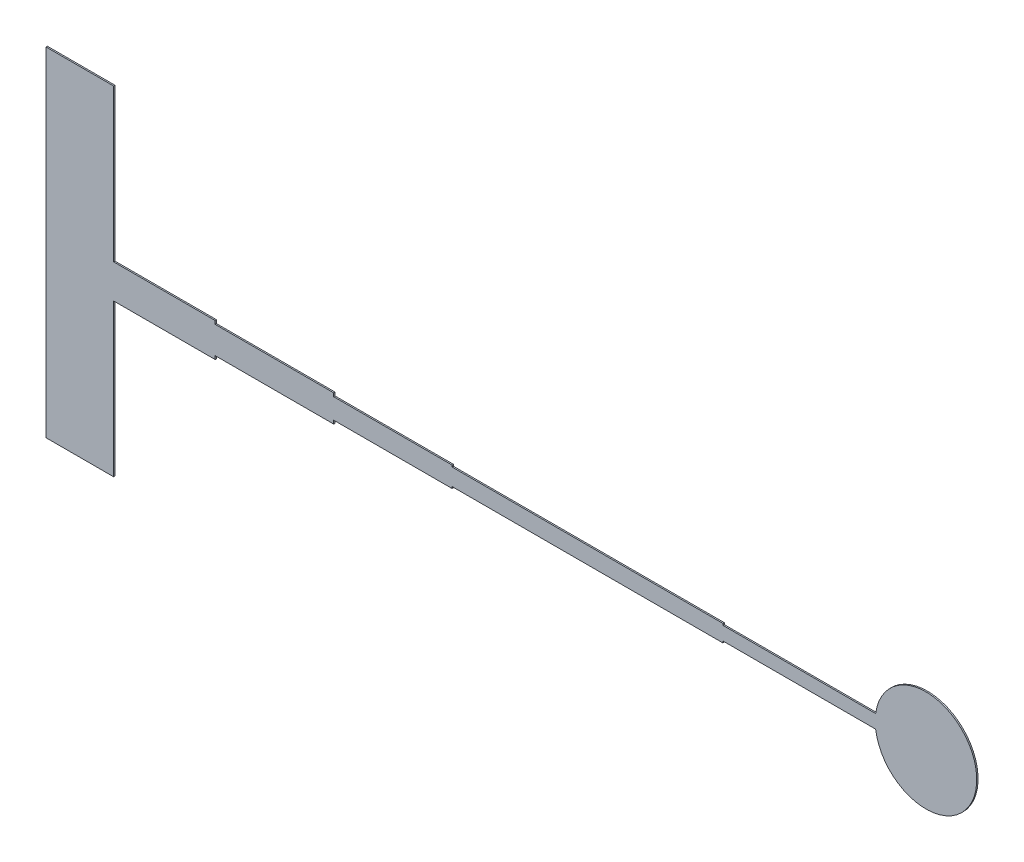
ISO-10303-21;
HEADER;
FILE_DESCRIPTION(('STEP AP214'),'2;1');
FILE_NAME('part.step','',(''),(''),'','','');
FILE_SCHEMA(('AUTOMOTIVE_DESIGN { 1 0 10303 214 1 1 1 1 }'));
ENDSEC;
DATA;
#1=APPLICATION_CONTEXT('core data for automotive mechanical design processes');
#2=APPLICATION_PROTOCOL_DEFINITION('international standard','automotive_design',2000,#1);
#3=PRODUCT_CONTEXT('',#1,'mechanical');
#4=PRODUCT('Part','Part','',(#3));
#5=PRODUCT_RELATED_PRODUCT_CATEGORY('part','',(#4));
#6=PRODUCT_DEFINITION_FORMATION('','',#4);
#7=PRODUCT_DEFINITION_CONTEXT('part definition',#1,'design');
#8=PRODUCT_DEFINITION('design','',#6,#7);
#9=PRODUCT_DEFINITION_SHAPE('','',#8);
#10=(LENGTH_UNIT() NAMED_UNIT(*) SI_UNIT(.MILLI.,.METRE.));
#11=(NAMED_UNIT(*) PLANE_ANGLE_UNIT() SI_UNIT($,.RADIAN.));
#12=(NAMED_UNIT(*) SI_UNIT($,.STERADIAN.) SOLID_ANGLE_UNIT());
#13=UNCERTAINTY_MEASURE_WITH_UNIT(LENGTH_MEASURE(1.E-05),#10,'distance_accuracy_value','');
#14=(GEOMETRIC_REPRESENTATION_CONTEXT(3) GLOBAL_UNCERTAINTY_ASSIGNED_CONTEXT((#13)) GLOBAL_UNIT_ASSIGNED_CONTEXT((#10,
#11,#12)) REPRESENTATION_CONTEXT('',''));
#15=CARTESIAN_POINT('',(0.,0.,0.));
#16=DIRECTION('',(0.,0.,1.));
#17=DIRECTION('',(1.,0.,0.));
#18=AXIS2_PLACEMENT_3D('',#15,#16,#17);
#19=CARTESIAN_POINT('',(5000.,-124.999999999995,-20.));
#20=DIRECTION('',(1.,0.,0.));
#21=DIRECTION('',(0.,0.,-1.));
#22=AXIS2_PLACEMENT_3D('',#19,#20,#21);
#23=PLANE('',#22);
#24=DIRECTION('',(0.,1.,0.));
#25=VECTOR('',#24,1.);
#26=CARTESIAN_POINT('',(5000.,-124.999999999995,0.));
#27=LINE('',#26,#25);
#28=CARTESIAN_POINT('',(5000.,-150.,0.));
#29=VERTEX_POINT('',#28);
#30=CARTESIAN_POINT('',(5000.,-124.999999999995,0.));
#31=VERTEX_POINT('',#30);
#32=EDGE_CURVE('E259',#29,#31,#27,.T.);
#33=ORIENTED_EDGE('',*,*,#32,.F.);
#34=DIRECTION('',(0.,0.,1.));
#35=VECTOR('',#34,1.);
#36=CARTESIAN_POINT('',(5000.,-150.,-20.));
#37=LINE('',#36,#35);
#38=CARTESIAN_POINT('',(5000.,-150.,-20.));
#39=VERTEX_POINT('',#38);
#40=EDGE_CURVE('E68',#39,#29,#37,.T.);
#41=ORIENTED_EDGE('',*,*,#40,.F.);
#42=DIRECTION('',(0.,1.,0.));
#43=VECTOR('',#42,1.);
#44=CARTESIAN_POINT('',(5000.,-124.999999999995,-20.));
#45=LINE('',#44,#43);
#46=CARTESIAN_POINT('',(5000.,-124.999999999995,-20.));
#47=VERTEX_POINT('',#46);
#48=EDGE_CURVE('E341',#39,#47,#45,.T.);
#49=ORIENTED_EDGE('',*,*,#48,.T.);
#50=DIRECTION('',(0.,0.,1.));
#51=VECTOR('',#50,1.);
#52=CARTESIAN_POINT('',(5000.,-124.999999999995,-20.));
#53=LINE('',#52,#51);
#54=EDGE_CURVE('E46',#47,#31,#53,.T.);
#55=ORIENTED_EDGE('',*,*,#54,.T.);
#56=EDGE_LOOP('',(#33,#41,#49,#55));
#57=FACE_BOUND('',#56,.T.);
#58=ADVANCED_FACE('F42',(#57),#23,.T.);
#59=CARTESIAN_POINT('',(1000.,-250.,-20.));
#60=DIRECTION('',(0.,-1.,0.));
#61=DIRECTION('',(1.,0.,0.));
#62=AXIS2_PLACEMENT_3D('',#59,#60,#61);
#63=PLANE('',#62);
#64=DIRECTION('',(1.,0.,0.));
#65=VECTOR('',#64,1.);
#66=CARTESIAN_POINT('',(1000.,-250.,-20.));
#67=LINE('',#66,#65);
#68=CARTESIAN_POINT('',(0.,-250.,-20.));
#69=VERTEX_POINT('',#68);
#70=CARTESIAN_POINT('',(1500.,-250.,-20.));
#71=VERTEX_POINT('',#70);
#72=EDGE_CURVE('E307',#69,#71,#67,.T.);
#73=ORIENTED_EDGE('',*,*,#72,.T.);
#74=DIRECTION('',(0.,0.,1.));
#75=VECTOR('',#74,1.);
#76=CARTESIAN_POINT('',(1500.,-250.,-20.));
#77=LINE('',#76,#75);
#78=CARTESIAN_POINT('',(1500.,-250.,0.));
#79=VERTEX_POINT('',#78);
#80=EDGE_CURVE('E363',#71,#79,#77,.T.);
#81=ORIENTED_EDGE('',*,*,#80,.T.);
#82=DIRECTION('',(1.,0.,0.));
#83=VECTOR('',#82,1.);
#84=CARTESIAN_POINT('',(1000.,-250.,0.));
#85=LINE('',#84,#83);
#86=CARTESIAN_POINT('',(0.,-250.,0.));
#87=VERTEX_POINT('',#86);
#88=EDGE_CURVE('E255',#87,#79,#85,.T.);
#89=ORIENTED_EDGE('',*,*,#88,.F.);
#90=DIRECTION('',(0.,0.,1.));
#91=VECTOR('',#90,1.);
#92=CARTESIAN_POINT('',(0.,-250.,-20.));
#93=LINE('',#92,#91);
#94=EDGE_CURVE('E393',#69,#87,#93,.T.);
#95=ORIENTED_EDGE('',*,*,#94,.F.);
#96=EDGE_LOOP('',(#73,#81,#89,#95));
#97=FACE_BOUND('',#96,.T.);
#98=ADVANCED_FACE('F44',(#97),#63,.T.);
#99=CARTESIAN_POINT('',(12000.,2.44249065417534E-12,-20.));
#100=DIRECTION('',(0.,0.,1.));
#101=DIRECTION('',(1.,0.,0.));
#102=AXIS2_PLACEMENT_3D('',#99,#100,#101);
#103=PLANE('',#102);
#104=DIRECTION('',(-1.,0.,0.));
#105=VECTOR('',#104,1.);
#106=CARTESIAN_POINT('',(1000.,250.,-20.));
#107=LINE('',#106,#105);
#108=CARTESIAN_POINT('',(1500.,250.,-20.));
#109=VERTEX_POINT('',#108);
#110=CARTESIAN_POINT('',(-2.22044604925031E-13,250.,-20.));
#111=VERTEX_POINT('',#110);
#112=EDGE_CURVE('E224',#109,#111,#107,.T.);
#113=ORIENTED_EDGE('',*,*,#112,.F.);
#114=DIRECTION('',(0.,-1.,0.));
#115=VECTOR('',#114,1.);
#116=CARTESIAN_POINT('',(1500.,250.,-20.));
#117=LINE('',#116,#115);
#118=CARTESIAN_POINT('',(1500.,200.,-20.));
#119=VERTEX_POINT('',#118);
#120=EDGE_CURVE('E205',#109,#119,#117,.T.);
#121=ORIENTED_EDGE('',*,*,#120,.T.);
#122=DIRECTION('',(1.,0.,0.));
#123=VECTOR('',#122,1.);
#124=CARTESIAN_POINT('',(1500.,200.,-20.));
#125=LINE('',#124,#123);
#126=CARTESIAN_POINT('',(3250.,200.,-20.));
#127=VERTEX_POINT('',#126);
#128=EDGE_CURVE('E513',#119,#127,#125,.T.);
#129=ORIENTED_EDGE('',*,*,#128,.T.);
#130=DIRECTION('',(0.,-1.,0.));
#131=VECTOR('',#130,1.);
#132=CARTESIAN_POINT('',(3250.,200.,-20.));
#133=LINE('',#132,#131);
#134=CARTESIAN_POINT('',(3250.,150.,-20.));
#135=VERTEX_POINT('',#134);
#136=EDGE_CURVE('E528',#127,#135,#133,.T.);
#137=ORIENTED_EDGE('',*,*,#136,.T.);
#138=DIRECTION('',(1.,0.,0.));
#139=VECTOR('',#138,1.);
#140=CARTESIAN_POINT('',(3250.,150.,-20.));
#141=LINE('',#140,#139);
#142=CARTESIAN_POINT('',(5000.,150.,-20.));
#143=VERTEX_POINT('',#142);
#144=EDGE_CURVE('E217',#135,#143,#141,.T.);
#145=ORIENTED_EDGE('',*,*,#144,.T.);
#146=DIRECTION('',(0.,1.,0.));
#147=VECTOR('',#146,1.);
#148=CARTESIAN_POINT('',(5000.,250.,-20.));
#149=LINE('',#148,#147);
#150=CARTESIAN_POINT('',(5000.,125.,-20.));
#151=VERTEX_POINT('',#150);
#152=EDGE_CURVE('E237',#151,#143,#149,.T.);
#153=ORIENTED_EDGE('',*,*,#152,.F.);
#154=DIRECTION('',(-1.,0.,0.));
#155=VECTOR('',#154,1.);
#156=CARTESIAN_POINT('',(5000.,125.,-20.));
#157=LINE('',#156,#155);
#158=CARTESIAN_POINT('',(9000.,125.000000000002,-20.));
#159=VERTEX_POINT('',#158);
#160=EDGE_CURVE('E244',#159,#151,#157,.T.);
#161=ORIENTED_EDGE('',*,*,#160,.F.);
#162=DIRECTION('',(0.,1.,0.));
#163=VECTOR('',#162,1.);
#164=CARTESIAN_POINT('',(9000.,125.000000000002,-20.));
#165=LINE('',#164,#163);
#166=CARTESIAN_POINT('',(9000.,100.000000000003,-20.));
#167=VERTEX_POINT('',#166);
#168=EDGE_CURVE('E430',#167,#159,#165,.T.);
#169=ORIENTED_EDGE('',*,*,#168,.F.);
#170=DIRECTION('',(-1.,0.,0.));
#171=VECTOR('',#170,1.);
#172=CARTESIAN_POINT('',(9000.,100.000000000003,-20.));
#173=LINE('',#172,#171);
#174=CARTESIAN_POINT('',(11256.6965626341,100.000000000003,-20.));
#175=VERTEX_POINT('',#174);
#176=EDGE_CURVE('E426',#175,#167,#173,.T.);
#177=ORIENTED_EDGE('',*,*,#176,.F.);
#178=CARTESIAN_POINT('',(12000.,2.44249065417534E-12,-20.));
#179=DIRECTION('',(0.,0.,1.));
#180=DIRECTION('',(1.,0.,0.));
#181=AXIS2_PLACEMENT_3D('',#178,#179,#180);
#182=CIRCLE('',#181,749.999999999999);
#183=CARTESIAN_POINT('',(11256.6965626341,-99.9999999999971,-20.));
#184=VERTEX_POINT('',#183);
#185=EDGE_CURVE('E422',#184,#175,#182,.T.);
#186=ORIENTED_EDGE('',*,*,#185,.F.);
#187=DIRECTION('',(1.,0.,0.));
#188=VECTOR('',#187,1.);
#189=CARTESIAN_POINT('',(9000.,-99.9999999999962,-20.));
#190=LINE('',#189,#188);
#191=CARTESIAN_POINT('',(9000.,-99.9999999999962,-20.));
#192=VERTEX_POINT('',#191);
#193=EDGE_CURVE('E418',#192,#184,#190,.T.);
#194=ORIENTED_EDGE('',*,*,#193,.F.);
#195=DIRECTION('',(0.,1.,0.));
#196=VECTOR('',#195,1.);
#197=CARTESIAN_POINT('',(9000.,-99.9999999999962,-20.));
#198=LINE('',#197,#196);
#199=CARTESIAN_POINT('',(9000.,-124.999999999998,-20.));
#200=VERTEX_POINT('',#199);
#201=EDGE_CURVE('E414',#200,#192,#198,.T.);
#202=ORIENTED_EDGE('',*,*,#201,.F.);
#203=DIRECTION('',(1.,0.,0.));
#204=VECTOR('',#203,1.);
#205=CARTESIAN_POINT('',(5000.,-124.999999999995,-20.));
#206=LINE('',#205,#204);
#207=EDGE_CURVE('E411',#47,#200,#206,.T.);
#208=ORIENTED_EDGE('',*,*,#207,.F.);
#209=ORIENTED_EDGE('',*,*,#48,.F.);
#210=DIRECTION('',(1.,0.,0.));
#211=VECTOR('',#210,1.);
#212=CARTESIAN_POINT('',(3250.,-150.,-20.));
#213=LINE('',#212,#211);
#214=CARTESIAN_POINT('',(3250.,-150.,-20.));
#215=VERTEX_POINT('',#214);
#216=EDGE_CURVE('E367',#215,#39,#213,.T.);
#217=ORIENTED_EDGE('',*,*,#216,.F.);
#218=DIRECTION('',(0.,1.,0.));
#219=VECTOR('',#218,1.);
#220=CARTESIAN_POINT('',(3250.,-200.,-20.));
#221=LINE('',#220,#219);
#222=CARTESIAN_POINT('',(3250.,-200.,-20.));
#223=VERTEX_POINT('',#222);
#224=EDGE_CURVE('E498',#223,#215,#221,.T.);
#225=ORIENTED_EDGE('',*,*,#224,.F.);
#226=DIRECTION('',(1.,0.,0.));
#227=VECTOR('',#226,1.);
#228=CARTESIAN_POINT('',(1500.,-200.,-20.));
#229=LINE('',#228,#227);
#230=CARTESIAN_POINT('',(1500.,-200.,-20.));
#231=VERTEX_POINT('',#230);
#232=EDGE_CURVE('E357',#231,#223,#229,.T.);
#233=ORIENTED_EDGE('',*,*,#232,.F.);
#234=DIRECTION('',(0.,1.,0.));
#235=VECTOR('',#234,1.);
#236=CARTESIAN_POINT('',(1500.,-250.,-20.));
#237=LINE('',#236,#235);
#238=EDGE_CURVE('E353',#71,#231,#237,.T.);
#239=ORIENTED_EDGE('',*,*,#238,.F.);
#240=ORIENTED_EDGE('',*,*,#72,.F.);
#241=DIRECTION('',(0.,-1.,0.));
#242=VECTOR('',#241,1.);
#243=CARTESIAN_POINT('',(0.,-2500.,-20.));
#244=LINE('',#243,#242);
#245=CARTESIAN_POINT('',(0.,-2500.,-20.));
#246=VERTEX_POINT('',#245);
#247=EDGE_CURVE('E397',#69,#246,#244,.T.);
#248=ORIENTED_EDGE('',*,*,#247,.T.);
#249=DIRECTION('',(1.,0.,0.));
#250=VECTOR('',#249,1.);
#251=CARTESIAN_POINT('',(-1000.,-2500.,-20.));
#252=LINE('',#251,#250);
#253=CARTESIAN_POINT('',(-1000.,-2500.,-20.));
#254=VERTEX_POINT('',#253);
#255=EDGE_CURVE('E251',#254,#246,#252,.T.);
#256=ORIENTED_EDGE('',*,*,#255,.F.);
#257=DIRECTION('',(0.,-1.,0.));
#258=VECTOR('',#257,1.);
#259=CARTESIAN_POINT('',(-1000.,2500.,-20.));
#260=LINE('',#259,#258);
#261=CARTESIAN_POINT('',(-1000.,2500.,-20.));
#262=VERTEX_POINT('',#261);
#263=EDGE_CURVE('E241',#262,#254,#260,.T.);
#264=ORIENTED_EDGE('',*,*,#263,.F.);
#265=DIRECTION('',(-1.,0.,0.));
#266=VECTOR('',#265,1.);
#267=CARTESIAN_POINT('',(-1000.,2500.,-20.));
#268=LINE('',#267,#266);
#269=CARTESIAN_POINT('',(-4.44089209850063E-13,2500.,-20.));
#270=VERTEX_POINT('',#269);
#271=EDGE_CURVE('E236',#270,#262,#268,.T.);
#272=ORIENTED_EDGE('',*,*,#271,.F.);
#273=DIRECTION('',(0.,-1.,0.));
#274=VECTOR('',#273,1.);
#275=CARTESIAN_POINT('',(-4.44089209850063E-13,2500.,-20.));
#276=LINE('',#275,#274);
#277=EDGE_CURVE('E234',#270,#111,#276,.T.);
#278=ORIENTED_EDGE('',*,*,#277,.T.);
#279=EDGE_LOOP('',(#113,#121,#129,#137,#145,#153,#161,#169,#177,#186,#194,#202,#208,#209,#217,
#225,#233,#239,#240,#248,#256,#264,#272,#278));
#280=FACE_BOUND('',#279,.T.);
#281=ADVANCED_FACE('F232',(#280),#103,.F.);
#282=CARTESIAN_POINT('',(12000.,2.44249065417534E-12,0.));
#283=DIRECTION('',(0.,0.,1.));
#284=DIRECTION('',(1.,0.,0.));
#285=AXIS2_PLACEMENT_3D('',#282,#283,#284);
#286=PLANE('',#285);
#287=DIRECTION('',(0.,-1.,0.));
#288=VECTOR('',#287,1.);
#289=CARTESIAN_POINT('',(1500.,250.,0.));
#290=LINE('',#289,#288);
#291=CARTESIAN_POINT('',(1500.,250.,0.));
#292=VERTEX_POINT('',#291);
#293=CARTESIAN_POINT('',(1500.,200.,0.));
#294=VERTEX_POINT('',#293);
#295=EDGE_CURVE('E523',#292,#294,#290,.T.);
#296=ORIENTED_EDGE('',*,*,#295,.F.);
#297=DIRECTION('',(-1.,0.,0.));
#298=VECTOR('',#297,1.);
#299=CARTESIAN_POINT('',(1000.,250.,0.));
#300=LINE('',#299,#298);
#301=CARTESIAN_POINT('',(-2.22044604925031E-13,250.,0.));
#302=VERTEX_POINT('',#301);
#303=EDGE_CURVE('E226',#292,#302,#300,.T.);
#304=ORIENTED_EDGE('',*,*,#303,.T.);
#305=DIRECTION('',(0.,-1.,0.));
#306=VECTOR('',#305,1.);
#307=CARTESIAN_POINT('',(-4.44089209850063E-13,2500.,0.));
#308=LINE('',#307,#306);
#309=CARTESIAN_POINT('',(0.,2500.,0.));
#310=VERTEX_POINT('',#309);
#311=EDGE_CURVE('E384',#310,#302,#308,.T.);
#312=ORIENTED_EDGE('',*,*,#311,.F.);
#313=DIRECTION('',(-1.,0.,0.));
#314=VECTOR('',#313,1.);
#315=CARTESIAN_POINT('',(-1000.,2500.,0.));
#316=LINE('',#315,#314);
#317=CARTESIAN_POINT('',(-1000.,2500.,0.));
#318=VERTEX_POINT('',#317);
#319=EDGE_CURVE('E297',#310,#318,#316,.T.);
#320=ORIENTED_EDGE('',*,*,#319,.T.);
#321=DIRECTION('',(0.,-1.,0.));
#322=VECTOR('',#321,1.);
#323=CARTESIAN_POINT('',(-1000.,2500.,0.));
#324=LINE('',#323,#322);
#325=CARTESIAN_POINT('',(-1000.,-2500.,0.));
#326=VERTEX_POINT('',#325);
#327=EDGE_CURVE('E300',#318,#326,#324,.T.);
#328=ORIENTED_EDGE('',*,*,#327,.T.);
#329=DIRECTION('',(1.,0.,0.));
#330=VECTOR('',#329,1.);
#331=CARTESIAN_POINT('',(-1000.,-2500.,0.));
#332=LINE('',#331,#330);
#333=CARTESIAN_POINT('',(0.,-2500.,0.));
#334=VERTEX_POINT('',#333);
#335=EDGE_CURVE('E304',#326,#334,#332,.T.);
#336=ORIENTED_EDGE('',*,*,#335,.T.);
#337=DIRECTION('',(0.,-1.,0.));
#338=VECTOR('',#337,1.);
#339=CARTESIAN_POINT('',(0.,-2500.,0.));
#340=LINE('',#339,#338);
#341=EDGE_CURVE('E388',#87,#334,#340,.T.);
#342=ORIENTED_EDGE('',*,*,#341,.F.);
#343=ORIENTED_EDGE('',*,*,#88,.T.);
#344=DIRECTION('',(0.,1.,0.));
#345=VECTOR('',#344,1.);
#346=CARTESIAN_POINT('',(1500.,-250.,0.));
#347=LINE('',#346,#345);
#348=CARTESIAN_POINT('',(1500.,-200.,0.));
#349=VERTEX_POINT('',#348);
#350=EDGE_CURVE('E228',#79,#349,#347,.T.);
#351=ORIENTED_EDGE('',*,*,#350,.T.);
#352=DIRECTION('',(1.,0.,0.));
#353=VECTOR('',#352,1.);
#354=CARTESIAN_POINT('',(1500.,-200.,0.));
#355=LINE('',#354,#353);
#356=CARTESIAN_POINT('',(3250.,-200.,0.));
#357=VERTEX_POINT('',#356);
#358=EDGE_CURVE('E359',#349,#357,#355,.T.);
#359=ORIENTED_EDGE('',*,*,#358,.T.);
#360=DIRECTION('',(0.,1.,0.));
#361=VECTOR('',#360,1.);
#362=CARTESIAN_POINT('',(3250.,-200.,0.));
#363=LINE('',#362,#361);
#364=CARTESIAN_POINT('',(3250.,-150.,0.));
#365=VERTEX_POINT('',#364);
#366=EDGE_CURVE('E350',#357,#365,#363,.T.);
#367=ORIENTED_EDGE('',*,*,#366,.T.);
#368=DIRECTION('',(1.,0.,0.));
#369=VECTOR('',#368,1.);
#370=CARTESIAN_POINT('',(3250.,-150.,0.));
#371=LINE('',#370,#369);
#372=EDGE_CURVE('E347',#365,#29,#371,.T.);
#373=ORIENTED_EDGE('',*,*,#372,.T.);
#374=ORIENTED_EDGE('',*,*,#32,.T.);
#375=DIRECTION('',(1.,0.,0.));
#376=VECTOR('',#375,1.);
#377=CARTESIAN_POINT('',(5000.,-124.999999999995,0.));
#378=LINE('',#377,#376);
#379=CARTESIAN_POINT('',(9000.,-124.999999999998,0.));
#380=VERTEX_POINT('',#379);
#381=EDGE_CURVE('E263',#31,#380,#378,.T.);
#382=ORIENTED_EDGE('',*,*,#381,.T.);
#383=DIRECTION('',(0.,1.,0.));
#384=VECTOR('',#383,1.);
#385=CARTESIAN_POINT('',(9000.,-99.9999999999962,0.));
#386=LINE('',#385,#384);
#387=CARTESIAN_POINT('',(9000.,-99.9999999999962,0.));
#388=VERTEX_POINT('',#387);
#389=EDGE_CURVE('E267',#380,#388,#386,.T.);
#390=ORIENTED_EDGE('',*,*,#389,.T.);
#391=DIRECTION('',(1.,0.,0.));
#392=VECTOR('',#391,1.);
#393=CARTESIAN_POINT('',(9000.,-99.9999999999962,0.));
#394=LINE('',#393,#392);
#395=CARTESIAN_POINT('',(11256.6965626341,-99.9999999999971,0.));
#396=VERTEX_POINT('',#395);
#397=EDGE_CURVE('E271',#388,#396,#394,.T.);
#398=ORIENTED_EDGE('',*,*,#397,.T.);
#399=CARTESIAN_POINT('',(12000.,2.44249065417534E-12,0.));
#400=DIRECTION('',(0.,0.,1.));
#401=DIRECTION('',(1.,0.,0.));
#402=AXIS2_PLACEMENT_3D('',#399,#400,#401);
#403=CIRCLE('',#402,749.999999999999);
#404=CARTESIAN_POINT('',(11256.6965626341,100.000000000003,0.));
#405=VERTEX_POINT('',#404);
#406=EDGE_CURVE('E275',#396,#405,#403,.T.);
#407=ORIENTED_EDGE('',*,*,#406,.T.);
#408=DIRECTION('',(-1.,0.,0.));
#409=VECTOR('',#408,1.);
#410=CARTESIAN_POINT('',(9000.,100.000000000003,0.));
#411=LINE('',#410,#409);
#412=CARTESIAN_POINT('',(9000.,100.000000000003,0.));
#413=VERTEX_POINT('',#412);
#414=EDGE_CURVE('E279',#405,#413,#411,.T.);
#415=ORIENTED_EDGE('',*,*,#414,.T.);
#416=DIRECTION('',(0.,1.,0.));
#417=VECTOR('',#416,1.);
#418=CARTESIAN_POINT('',(9000.,125.000000000002,0.));
#419=LINE('',#418,#417);
#420=CARTESIAN_POINT('',(9000.,125.000000000002,0.));
#421=VERTEX_POINT('',#420);
#422=EDGE_CURVE('E283',#413,#421,#419,.T.);
#423=ORIENTED_EDGE('',*,*,#422,.T.);
#424=DIRECTION('',(-1.,0.,0.));
#425=VECTOR('',#424,1.);
#426=CARTESIAN_POINT('',(5000.,125.,0.));
#427=LINE('',#426,#425);
#428=CARTESIAN_POINT('',(5000.,125.,0.));
#429=VERTEX_POINT('',#428);
#430=EDGE_CURVE('E287',#421,#429,#427,.T.);
#431=ORIENTED_EDGE('',*,*,#430,.T.);
#432=DIRECTION('',(0.,1.,0.));
#433=VECTOR('',#432,1.);
#434=CARTESIAN_POINT('',(5000.,250.,0.));
#435=LINE('',#434,#433);
#436=CARTESIAN_POINT('',(5000.,150.,0.));
#437=VERTEX_POINT('',#436);
#438=EDGE_CURVE('E291',#429,#437,#435,.T.);
#439=ORIENTED_EDGE('',*,*,#438,.T.);
#440=DIRECTION('',(1.,0.,0.));
#441=VECTOR('',#440,1.);
#442=CARTESIAN_POINT('',(3250.,150.,0.));
#443=LINE('',#442,#441);
#444=CARTESIAN_POINT('',(3250.,150.,0.));
#445=VERTEX_POINT('',#444);
#446=EDGE_CURVE('E60',#445,#437,#443,.T.);
#447=ORIENTED_EDGE('',*,*,#446,.F.);
#448=DIRECTION('',(0.,-1.,0.));
#449=VECTOR('',#448,1.);
#450=CARTESIAN_POINT('',(3250.,200.,0.));
#451=LINE('',#450,#449);
#452=CARTESIAN_POINT('',(3250.,200.,0.));
#453=VERTEX_POINT('',#452);
#454=EDGE_CURVE('E517',#453,#445,#451,.T.);
#455=ORIENTED_EDGE('',*,*,#454,.F.);
#456=DIRECTION('',(1.,0.,0.));
#457=VECTOR('',#456,1.);
#458=CARTESIAN_POINT('',(1500.,200.,0.));
#459=LINE('',#458,#457);
#460=EDGE_CURVE('E218',#294,#453,#459,.T.);
#461=ORIENTED_EDGE('',*,*,#460,.F.);
#462=EDGE_LOOP('',(#296,#304,#312,#320,#328,#336,#342,#343,#351,#359,#367,#373,#374,#382,#390,
#398,#407,#415,#423,#431,#439,#447,#455,#461));
#463=FACE_BOUND('',#462,.T.);
#464=ADVANCED_FACE('F345',(#463),#286,.T.);
#465=CARTESIAN_POINT('',(-1000.,-2500.,-20.));
#466=DIRECTION('',(0.,-1.,0.));
#467=DIRECTION('',(0.,0.,-1.));
#468=AXIS2_PLACEMENT_3D('',#465,#466,#467);
#469=PLANE('',#468);
#470=DIRECTION('',(0.,0.,1.));
#471=VECTOR('',#470,1.);
#472=CARTESIAN_POINT('',(0.,-2500.,-20.));
#473=LINE('',#472,#471);
#474=EDGE_CURVE('E380',#246,#334,#473,.T.);
#475=ORIENTED_EDGE('',*,*,#474,.T.);
#476=ORIENTED_EDGE('',*,*,#335,.F.);
#477=DIRECTION('',(0.,0.,1.));
#478=VECTOR('',#477,1.);
#479=CARTESIAN_POINT('',(-1000.,-2500.,-20.));
#480=LINE('',#479,#478);
#481=EDGE_CURVE('E11',#254,#326,#480,.T.);
#482=ORIENTED_EDGE('',*,*,#481,.F.);
#483=ORIENTED_EDGE('',*,*,#255,.T.);
#484=EDGE_LOOP('',(#475,#476,#482,#483));
#485=FACE_BOUND('',#484,.T.);
#486=ADVANCED_FACE('F558',(#485),#469,.T.);
#487=CARTESIAN_POINT('',(-1000.,2500.,-20.));
#488=DIRECTION('',(-1.,0.,0.));
#489=DIRECTION('',(0.,-1.,0.));
#490=AXIS2_PLACEMENT_3D('',#487,#488,#489);
#491=PLANE('',#490);
#492=ORIENTED_EDGE('',*,*,#327,.F.);
#493=DIRECTION('',(0.,0.,1.));
#494=VECTOR('',#493,1.);
#495=CARTESIAN_POINT('',(-1000.,2500.,-20.));
#496=LINE('',#495,#494);
#497=EDGE_CURVE('E52',#262,#318,#496,.T.);
#498=ORIENTED_EDGE('',*,*,#497,.F.);
#499=ORIENTED_EDGE('',*,*,#263,.T.);
#500=ORIENTED_EDGE('',*,*,#481,.T.);
#501=EDGE_LOOP('',(#492,#498,#499,#500));
#502=FACE_BOUND('',#501,.T.);
#503=ADVANCED_FACE('F554',(#502),#491,.T.);
#504=CARTESIAN_POINT('',(-1000.,2500.,-20.));
#505=DIRECTION('',(0.,1.,0.));
#506=DIRECTION('',(0.,0.,1.));
#507=AXIS2_PLACEMENT_3D('',#504,#505,#506);
#508=PLANE('',#507);
#509=DIRECTION('',(0.,0.,1.));
#510=VECTOR('',#509,1.);
#511=CARTESIAN_POINT('',(-4.44089209850063E-13,2500.,-20.));
#512=LINE('',#511,#510);
#513=EDGE_CURVE('E383',#270,#310,#512,.T.);
#514=ORIENTED_EDGE('',*,*,#513,.F.);
#515=ORIENTED_EDGE('',*,*,#271,.T.);
#516=ORIENTED_EDGE('',*,*,#497,.T.);
#517=ORIENTED_EDGE('',*,*,#319,.F.);
#518=EDGE_LOOP('',(#514,#515,#516,#517));
#519=FACE_BOUND('',#518,.T.);
#520=ADVANCED_FACE('F549',(#519),#508,.T.);
#521=CARTESIAN_POINT('',(1000.,250.,-20.));
#522=DIRECTION('',(0.,1.,0.));
#523=DIRECTION('',(0.,0.,1.));
#524=AXIS2_PLACEMENT_3D('',#521,#522,#523);
#525=PLANE('',#524);
#526=DIRECTION('',(0.,0.,1.));
#527=VECTOR('',#526,1.);
#528=CARTESIAN_POINT('',(1500.,250.,-20.));
#529=LINE('',#528,#527);
#530=EDGE_CURVE('E209',#109,#292,#529,.T.);
#531=ORIENTED_EDGE('',*,*,#530,.F.);
#532=ORIENTED_EDGE('',*,*,#112,.T.);
#533=DIRECTION('',(0.,0.,1.));
#534=VECTOR('',#533,1.);
#535=CARTESIAN_POINT('',(-2.22044604925031E-13,250.,-20.));
#536=LINE('',#535,#534);
#537=EDGE_CURVE('E260',#111,#302,#536,.T.);
#538=ORIENTED_EDGE('',*,*,#537,.T.);
#539=ORIENTED_EDGE('',*,*,#303,.F.);
#540=EDGE_LOOP('',(#531,#532,#538,#539));
#541=FACE_BOUND('',#540,.T.);
#542=ADVANCED_FACE('F222',(#541),#525,.T.);
#543=CARTESIAN_POINT('',(5000.,250.,-20.));
#544=DIRECTION('',(1.,0.,0.));
#545=DIRECTION('',(0.,0.,-1.));
#546=AXIS2_PLACEMENT_3D('',#543,#544,#545);
#547=PLANE('',#546);
#548=DIRECTION('',(0.,0.,1.));
#549=VECTOR('',#548,1.);
#550=CARTESIAN_POINT('',(5000.,150.,-20.));
#551=LINE('',#550,#549);
#552=EDGE_CURVE('E229',#143,#437,#551,.T.);
#553=ORIENTED_EDGE('',*,*,#552,.T.);
#554=ORIENTED_EDGE('',*,*,#438,.F.);
#555=DIRECTION('',(0.,0.,1.));
#556=VECTOR('',#555,1.);
#557=CARTESIAN_POINT('',(5000.,125.,-20.));
#558=LINE('',#557,#556);
#559=EDGE_CURVE('E312',#151,#429,#558,.T.);
#560=ORIENTED_EDGE('',*,*,#559,.F.);
#561=ORIENTED_EDGE('',*,*,#152,.T.);
#562=EDGE_LOOP('',(#553,#554,#560,#561));
#563=FACE_BOUND('',#562,.T.);
#564=ADVANCED_FACE('F536',(#563),#547,.T.);
#565=CARTESIAN_POINT('',(5000.,125.,-20.));
#566=DIRECTION('',(0.,1.,0.));
#567=DIRECTION('',(-1.,0.,0.));
#568=AXIS2_PLACEMENT_3D('',#565,#566,#567);
#569=PLANE('',#568);
#570=ORIENTED_EDGE('',*,*,#430,.F.);
#571=DIRECTION('',(0.,0.,1.));
#572=VECTOR('',#571,1.);
#573=CARTESIAN_POINT('',(9000.,125.000000000002,-20.));
#574=LINE('',#573,#572);
#575=EDGE_CURVE('E315',#159,#421,#574,.T.);
#576=ORIENTED_EDGE('',*,*,#575,.F.);
#577=ORIENTED_EDGE('',*,*,#160,.T.);
#578=ORIENTED_EDGE('',*,*,#559,.T.);
#579=EDGE_LOOP('',(#570,#576,#577,#578));
#580=FACE_BOUND('',#579,.T.);
#581=ADVANCED_FACE('F438',(#580),#569,.T.);
#582=CARTESIAN_POINT('',(9000.,125.000000000002,-20.));
#583=DIRECTION('',(1.,0.,0.));
#584=DIRECTION('',(0.,0.,-1.));
#585=AXIS2_PLACEMENT_3D('',#582,#583,#584);
#586=PLANE('',#585);
#587=ORIENTED_EDGE('',*,*,#422,.F.);
#588=DIRECTION('',(0.,0.,1.));
#589=VECTOR('',#588,1.);
#590=CARTESIAN_POINT('',(9000.,100.000000000003,-20.));
#591=LINE('',#590,#589);
#592=EDGE_CURVE('E318',#167,#413,#591,.T.);
#593=ORIENTED_EDGE('',*,*,#592,.F.);
#594=ORIENTED_EDGE('',*,*,#168,.T.);
#595=ORIENTED_EDGE('',*,*,#575,.T.);
#596=EDGE_LOOP('',(#587,#593,#594,#595));
#597=FACE_BOUND('',#596,.T.);
#598=ADVANCED_FACE('F446',(#597),#586,.T.);
#599=CARTESIAN_POINT('',(9000.,100.000000000003,-20.));
#600=DIRECTION('',(0.,1.,0.));
#601=DIRECTION('',(-1.,0.,0.));
#602=AXIS2_PLACEMENT_3D('',#599,#600,#601);
#603=PLANE('',#602);
#604=ORIENTED_EDGE('',*,*,#414,.F.);
#605=DIRECTION('',(0.,0.,1.));
#606=VECTOR('',#605,1.);
#607=CARTESIAN_POINT('',(11256.6965626341,100.000000000003,-20.));
#608=LINE('',#607,#606);
#609=EDGE_CURVE('E321',#175,#405,#608,.T.);
#610=ORIENTED_EDGE('',*,*,#609,.F.);
#611=ORIENTED_EDGE('',*,*,#176,.T.);
#612=ORIENTED_EDGE('',*,*,#592,.T.);
#613=EDGE_LOOP('',(#604,#610,#611,#612));
#614=FACE_BOUND('',#613,.T.);
#615=ADVANCED_FACE('F449',(#614),#603,.T.);
#616=CARTESIAN_POINT('',(12000.,2.44249065417534E-12,-20.));
#617=DIRECTION('',(0.,0.,1.));
#618=DIRECTION('',(1.,0.,0.));
#619=AXIS2_PLACEMENT_3D('',#616,#617,#618);
#620=CYLINDRICAL_SURFACE('',#619,749.999999999999);
#621=ORIENTED_EDGE('',*,*,#406,.F.);
#622=DIRECTION('',(0.,0.,1.));
#623=VECTOR('',#622,1.);
#624=CARTESIAN_POINT('',(11256.6965626341,-99.9999999999971,-20.));
#625=LINE('',#624,#623);
#626=EDGE_CURVE('E324',#184,#396,#625,.T.);
#627=ORIENTED_EDGE('',*,*,#626,.F.);
#628=ORIENTED_EDGE('',*,*,#185,.T.);
#629=ORIENTED_EDGE('',*,*,#609,.T.);
#630=EDGE_LOOP('',(#621,#627,#628,#629));
#631=FACE_BOUND('',#630,.T.);
#632=ADVANCED_FACE('F454',(#631),#620,.T.);
#633=CARTESIAN_POINT('',(9000.,-99.9999999999962,-20.));
#634=DIRECTION('',(0.,-1.,0.));
#635=DIRECTION('',(1.,0.,0.));
#636=AXIS2_PLACEMENT_3D('',#633,#634,#635);
#637=PLANE('',#636);
#638=ORIENTED_EDGE('',*,*,#397,.F.);
#639=DIRECTION('',(0.,0.,1.));
#640=VECTOR('',#639,1.);
#641=CARTESIAN_POINT('',(9000.,-99.9999999999962,-20.));
#642=LINE('',#641,#640);
#643=EDGE_CURVE('E327',#192,#388,#642,.T.);
#644=ORIENTED_EDGE('',*,*,#643,.F.);
#645=ORIENTED_EDGE('',*,*,#193,.T.);
#646=ORIENTED_EDGE('',*,*,#626,.T.);
#647=EDGE_LOOP('',(#638,#644,#645,#646));
#648=FACE_BOUND('',#647,.T.);
#649=ADVANCED_FACE('F457',(#648),#637,.T.);
#650=CARTESIAN_POINT('',(9000.,-99.9999999999962,-20.));
#651=DIRECTION('',(1.,0.,0.));
#652=DIRECTION('',(0.,0.,-1.));
#653=AXIS2_PLACEMENT_3D('',#650,#651,#652);
#654=PLANE('',#653);
#655=ORIENTED_EDGE('',*,*,#389,.F.);
#656=DIRECTION('',(0.,0.,1.));
#657=VECTOR('',#656,1.);
#658=CARTESIAN_POINT('',(9000.,-124.999999999998,-20.));
#659=LINE('',#658,#657);
#660=EDGE_CURVE('E329',#200,#380,#659,.T.);
#661=ORIENTED_EDGE('',*,*,#660,.F.);
#662=ORIENTED_EDGE('',*,*,#201,.T.);
#663=ORIENTED_EDGE('',*,*,#643,.T.);
#664=EDGE_LOOP('',(#655,#661,#662,#663));
#665=FACE_BOUND('',#664,.T.);
#666=ADVANCED_FACE('F460',(#665),#654,.T.);
#667=CARTESIAN_POINT('',(5000.,-124.999999999995,-20.));
#668=DIRECTION('',(0.,-1.,0.));
#669=DIRECTION('',(1.,0.,0.));
#670=AXIS2_PLACEMENT_3D('',#667,#668,#669);
#671=PLANE('',#670);
#672=ORIENTED_EDGE('',*,*,#381,.F.);
#673=ORIENTED_EDGE('',*,*,#54,.F.);
#674=ORIENTED_EDGE('',*,*,#207,.T.);
#675=ORIENTED_EDGE('',*,*,#660,.T.);
#676=EDGE_LOOP('',(#672,#673,#674,#675));
#677=FACE_BOUND('',#676,.T.);
#678=ADVANCED_FACE('F343',(#677),#671,.T.);
#679=CARTESIAN_POINT('',(0.,-2500.,-20.));
#680=DIRECTION('',(-1.,0.,0.));
#681=DIRECTION('',(0.,0.,1.));
#682=AXIS2_PLACEMENT_3D('',#679,#680,#681);
#683=PLANE('',#682);
#684=ORIENTED_EDGE('',*,*,#341,.T.);
#685=ORIENTED_EDGE('',*,*,#474,.F.);
#686=ORIENTED_EDGE('',*,*,#247,.F.);
#687=ORIENTED_EDGE('',*,*,#94,.T.);
#688=EDGE_LOOP('',(#684,#685,#686,#687));
#689=FACE_BOUND('',#688,.T.);
#690=ADVANCED_FACE('F467',(#689),#683,.F.);
#691=CARTESIAN_POINT('',(-4.44089209850063E-13,2500.,-20.));
#692=DIRECTION('',(-1.,0.,0.));
#693=DIRECTION('',(0.,-1.,0.));
#694=AXIS2_PLACEMENT_3D('',#691,#692,#693);
#695=PLANE('',#694);
#696=ORIENTED_EDGE('',*,*,#311,.T.);
#697=ORIENTED_EDGE('',*,*,#537,.F.);
#698=ORIENTED_EDGE('',*,*,#277,.F.);
#699=ORIENTED_EDGE('',*,*,#513,.T.);
#700=EDGE_LOOP('',(#696,#697,#698,#699));
#701=FACE_BOUND('',#700,.T.);
#702=ADVANCED_FACE('F546',(#701),#695,.F.);
#703=CARTESIAN_POINT('',(1500.,-250.,-20.));
#704=DIRECTION('',(1.,0.,0.));
#705=DIRECTION('',(0.,0.,-1.));
#706=AXIS2_PLACEMENT_3D('',#703,#704,#705);
#707=PLANE('',#706);
#708=ORIENTED_EDGE('',*,*,#350,.F.);
#709=ORIENTED_EDGE('',*,*,#80,.F.);
#710=ORIENTED_EDGE('',*,*,#238,.T.);
#711=DIRECTION('',(0.,0.,1.));
#712=VECTOR('',#711,1.);
#713=CARTESIAN_POINT('',(1500.,-200.,-20.));
#714=LINE('',#713,#712);
#715=EDGE_CURVE('E376',#231,#349,#714,.T.);
#716=ORIENTED_EDGE('',*,*,#715,.T.);
#717=EDGE_LOOP('',(#708,#709,#710,#716));
#718=FACE_BOUND('',#717,.T.);
#719=ADVANCED_FACE('F487',(#718),#707,.T.);
#720=CARTESIAN_POINT('',(1500.,-200.,-20.));
#721=DIRECTION('',(0.,-1.,0.));
#722=DIRECTION('',(0.,0.,-1.));
#723=AXIS2_PLACEMENT_3D('',#720,#721,#722);
#724=PLANE('',#723);
#725=ORIENTED_EDGE('',*,*,#358,.F.);
#726=ORIENTED_EDGE('',*,*,#715,.F.);
#727=ORIENTED_EDGE('',*,*,#232,.T.);
#728=DIRECTION('',(0.,0.,1.));
#729=VECTOR('',#728,1.);
#730=CARTESIAN_POINT('',(3250.,-200.,-20.));
#731=LINE('',#730,#729);
#732=EDGE_CURVE('E373',#223,#357,#731,.T.);
#733=ORIENTED_EDGE('',*,*,#732,.T.);
#734=EDGE_LOOP('',(#725,#726,#727,#733));
#735=FACE_BOUND('',#734,.T.);
#736=ADVANCED_FACE('F490',(#735),#724,.T.);
#737=CARTESIAN_POINT('',(3250.,-200.,-20.));
#738=DIRECTION('',(1.,0.,0.));
#739=DIRECTION('',(0.,0.,-1.));
#740=AXIS2_PLACEMENT_3D('',#737,#738,#739);
#741=PLANE('',#740);
#742=ORIENTED_EDGE('',*,*,#366,.F.);
#743=ORIENTED_EDGE('',*,*,#732,.F.);
#744=ORIENTED_EDGE('',*,*,#224,.T.);
#745=DIRECTION('',(0.,0.,1.));
#746=VECTOR('',#745,1.);
#747=CARTESIAN_POINT('',(3250.,-150.,-20.));
#748=LINE('',#747,#746);
#749=EDGE_CURVE('E370',#215,#365,#748,.T.);
#750=ORIENTED_EDGE('',*,*,#749,.T.);
#751=EDGE_LOOP('',(#742,#743,#744,#750));
#752=FACE_BOUND('',#751,.T.);
#753=ADVANCED_FACE('F664',(#752),#741,.T.);
#754=CARTESIAN_POINT('',(3250.,-150.,-20.));
#755=DIRECTION('',(0.,-1.,0.));
#756=DIRECTION('',(0.,0.,-1.));
#757=AXIS2_PLACEMENT_3D('',#754,#755,#756);
#758=PLANE('',#757);
#759=ORIENTED_EDGE('',*,*,#372,.F.);
#760=ORIENTED_EDGE('',*,*,#749,.F.);
#761=ORIENTED_EDGE('',*,*,#216,.T.);
#762=ORIENTED_EDGE('',*,*,#40,.T.);
#763=EDGE_LOOP('',(#759,#760,#761,#762));
#764=FACE_BOUND('',#763,.T.);
#765=ADVANCED_FACE('F674',(#764),#758,.T.);
#766=CARTESIAN_POINT('',(1500.,250.,-20.));
#767=DIRECTION('',(-1.,0.,0.));
#768=DIRECTION('',(0.,0.,1.));
#769=AXIS2_PLACEMENT_3D('',#766,#767,#768);
#770=PLANE('',#769);
#771=ORIENTED_EDGE('',*,*,#295,.T.);
#772=DIRECTION('',(0.,0.,1.));
#773=VECTOR('',#772,1.);
#774=CARTESIAN_POINT('',(1500.,200.,-20.));
#775=LINE('',#774,#773);
#776=EDGE_CURVE('E211',#119,#294,#775,.T.);
#777=ORIENTED_EDGE('',*,*,#776,.F.);
#778=ORIENTED_EDGE('',*,*,#120,.F.);
#779=ORIENTED_EDGE('',*,*,#530,.T.);
#780=EDGE_LOOP('',(#771,#777,#778,#779));
#781=FACE_BOUND('',#780,.T.);
#782=ADVANCED_FACE('F208',(#781),#770,.F.);
#783=CARTESIAN_POINT('',(3250.,150.,-20.));
#784=DIRECTION('',(0.,-1.,0.));
#785=DIRECTION('',(0.,0.,-1.));
#786=AXIS2_PLACEMENT_3D('',#783,#784,#785);
#787=PLANE('',#786);
#788=ORIENTED_EDGE('',*,*,#446,.T.);
#789=ORIENTED_EDGE('',*,*,#552,.F.);
#790=ORIENTED_EDGE('',*,*,#144,.F.);
#791=DIRECTION('',(0.,0.,1.));
#792=VECTOR('',#791,1.);
#793=CARTESIAN_POINT('',(3250.,150.,-20.));
#794=LINE('',#793,#792);
#795=EDGE_CURVE('E505',#135,#445,#794,.T.);
#796=ORIENTED_EDGE('',*,*,#795,.T.);
#797=EDGE_LOOP('',(#788,#789,#790,#796));
#798=FACE_BOUND('',#797,.T.);
#799=ADVANCED_FACE('F717',(#798),#787,.F.);
#800=CARTESIAN_POINT('',(3250.,200.,-20.));
#801=DIRECTION('',(-1.,0.,0.));
#802=DIRECTION('',(0.,0.,1.));
#803=AXIS2_PLACEMENT_3D('',#800,#801,#802);
#804=PLANE('',#803);
#805=ORIENTED_EDGE('',*,*,#454,.T.);
#806=ORIENTED_EDGE('',*,*,#795,.F.);
#807=ORIENTED_EDGE('',*,*,#136,.F.);
#808=DIRECTION('',(0.,0.,1.));
#809=VECTOR('',#808,1.);
#810=CARTESIAN_POINT('',(3250.,200.,-20.));
#811=LINE('',#810,#809);
#812=EDGE_CURVE('E508',#127,#453,#811,.T.);
#813=ORIENTED_EDGE('',*,*,#812,.T.);
#814=EDGE_LOOP('',(#805,#806,#807,#813));
#815=FACE_BOUND('',#814,.T.);
#816=ADVANCED_FACE('F540',(#815),#804,.F.);
#817=CARTESIAN_POINT('',(1500.,200.,-20.));
#818=DIRECTION('',(0.,-1.,0.));
#819=DIRECTION('',(0.,0.,-1.));
#820=AXIS2_PLACEMENT_3D('',#817,#818,#819);
#821=PLANE('',#820);
#822=ORIENTED_EDGE('',*,*,#460,.T.);
#823=ORIENTED_EDGE('',*,*,#812,.F.);
#824=ORIENTED_EDGE('',*,*,#128,.F.);
#825=ORIENTED_EDGE('',*,*,#776,.T.);
#826=EDGE_LOOP('',(#822,#823,#824,#825));
#827=FACE_BOUND('',#826,.T.);
#828=ADVANCED_FACE('F542',(#827),#821,.F.);
#829=CLOSED_SHELL('',(#58,#98,#281,#464,#486,#503,#520,#542,#564,#581,#598,#615,#632,#649,#666,
#678,#690,#702,#719,#736,#753,#765,#782,#799,#816,#828));
#830=MANIFOLD_SOLID_BREP('B2',#829);
#831=ADVANCED_BREP_SHAPE_REPRESENTATION('',(#18,#830),#14);
#832=SHAPE_DEFINITION_REPRESENTATION(#9,#831);
ENDSEC;
END-ISO-10303-21;
